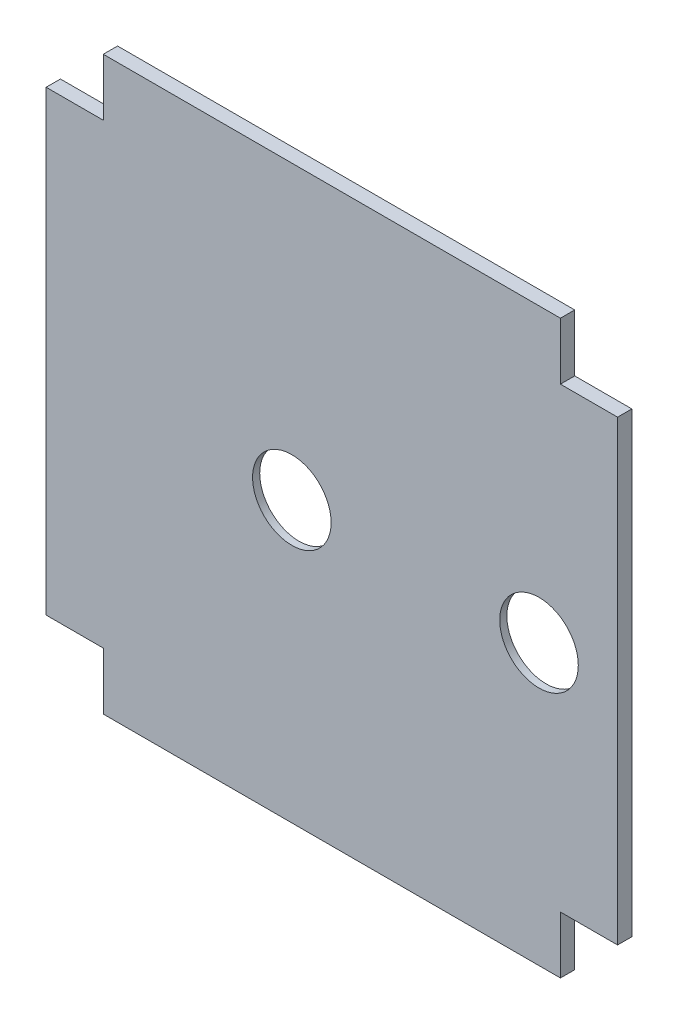
ISO-10303-21;
HEADER;
FILE_DESCRIPTION(('STEP AP214'),'2;1');
FILE_NAME('part.step','',(''),(''),'','','');
FILE_SCHEMA(('AUTOMOTIVE_DESIGN { 1 0 10303 214 1 1 1 1 }'));
ENDSEC;
DATA;
#1=APPLICATION_CONTEXT('core data for automotive mechanical design processes');
#2=APPLICATION_PROTOCOL_DEFINITION('international standard','automotive_design',2000,#1);
#3=PRODUCT_CONTEXT('',#1,'mechanical');
#4=PRODUCT('Part','Part','',(#3));
#5=PRODUCT_RELATED_PRODUCT_CATEGORY('part','',(#4));
#6=PRODUCT_DEFINITION_FORMATION('','',#4);
#7=PRODUCT_DEFINITION_CONTEXT('part definition',#1,'design');
#8=PRODUCT_DEFINITION('design','',#6,#7);
#9=PRODUCT_DEFINITION_SHAPE('','',#8);
#10=(LENGTH_UNIT() NAMED_UNIT(*) SI_UNIT(.MILLI.,.METRE.));
#11=(NAMED_UNIT(*) PLANE_ANGLE_UNIT() SI_UNIT($,.RADIAN.));
#12=(NAMED_UNIT(*) SI_UNIT($,.STERADIAN.) SOLID_ANGLE_UNIT());
#13=UNCERTAINTY_MEASURE_WITH_UNIT(LENGTH_MEASURE(1.E-05),#10,'distance_accuracy_value','');
#14=(GEOMETRIC_REPRESENTATION_CONTEXT(3) GLOBAL_UNCERTAINTY_ASSIGNED_CONTEXT((#13)) GLOBAL_UNIT_ASSIGNED_CONTEXT((#10,
#11,#12)) REPRESENTATION_CONTEXT('',''));
#15=CARTESIAN_POINT('',(0.,0.,0.));
#16=DIRECTION('',(0.,0.,1.));
#17=DIRECTION('',(1.,0.,0.));
#18=AXIS2_PLACEMENT_3D('',#15,#16,#17);
#19=CARTESIAN_POINT('',(43.000042234467,48.9430319989377,0.));
#20=DIRECTION('',(0.,0.,1.));
#21=DIRECTION('',(1.,0.,0.));
#22=AXIS2_PLACEMENT_3D('',#19,#20,#21);
#23=CYLINDRICAL_SURFACE('',#22,6.875);
#24=CARTESIAN_POINT('',(43.000042234467,48.9430319989377,2.5));
#25=DIRECTION('',(0.,0.,1.));
#26=DIRECTION('',(1.,0.,0.));
#27=AXIS2_PLACEMENT_3D('',#24,#25,#26);
#28=CIRCLE('',#27,6.875);
#29=CARTESIAN_POINT('',(49.875042234467,48.9430319989377,2.5));
#30=VERTEX_POINT('',#29);
#31=EDGE_CURVE('E164',#30,#30,#28,.T.);
#32=ORIENTED_EDGE('',*,*,#31,.T.);
#33=EDGE_LOOP('',(#32));
#34=FACE_BOUND('',#33,.T.);
#35=CARTESIAN_POINT('',(43.000042234467,48.9430319989377,1.25));
#36=DIRECTION('',(0.,0.,-1.));
#37=DIRECTION('',(-1.,0.,0.));
#38=AXIS2_PLACEMENT_3D('',#35,#36,#37);
#39=CIRCLE('',#38,6.875);
#40=CARTESIAN_POINT('',(36.125042234467,48.9430319989377,1.25));
#41=VERTEX_POINT('',#40);
#42=EDGE_CURVE('E39',#41,#41,#39,.F.);
#43=ORIENTED_EDGE('',*,*,#42,.F.);
#44=EDGE_LOOP('',(#43));
#45=FACE_BOUND('',#44,.T.);
#46=ADVANCED_FACE('F35',(#34,#45),#23,.F.);
#47=CARTESIAN_POINT('',(86.250042234467,48.9430319989376,0.));
#48=DIRECTION('',(0.,0.,1.));
#49=DIRECTION('',(1.,0.,0.));
#50=AXIS2_PLACEMENT_3D('',#47,#48,#49);
#51=CYLINDRICAL_SURFACE('',#50,6.87499999999999);
#52=CARTESIAN_POINT('',(86.250042234467,48.9430319989376,2.5));
#53=DIRECTION('',(0.,0.,1.));
#54=DIRECTION('',(1.,0.,0.));
#55=AXIS2_PLACEMENT_3D('',#52,#53,#54);
#56=CIRCLE('',#55,6.87499999999999);
#57=CARTESIAN_POINT('',(93.125042234467,48.9430319989376,2.5));
#58=VERTEX_POINT('',#57);
#59=EDGE_CURVE('E171',#58,#58,#56,.T.);
#60=ORIENTED_EDGE('',*,*,#59,.T.);
#61=EDGE_LOOP('',(#60));
#62=FACE_BOUND('',#61,.T.);
#63=CARTESIAN_POINT('',(86.250042234467,48.9430319989376,1.25));
#64=DIRECTION('',(0.,0.,-1.));
#65=DIRECTION('',(-1.,0.,0.));
#66=AXIS2_PLACEMENT_3D('',#63,#64,#65);
#67=CIRCLE('',#66,6.87499999999999);
#68=CARTESIAN_POINT('',(79.375042234467,48.9430319989376,1.25));
#69=VERTEX_POINT('',#68);
#70=EDGE_CURVE('E175',#69,#69,#67,.F.);
#71=ORIENTED_EDGE('',*,*,#70,.F.);
#72=EDGE_LOOP('',(#71));
#73=FACE_BOUND('',#72,.T.);
#74=ADVANCED_FACE('F221',(#62,#73),#51,.F.);
#75=CARTESIAN_POINT('',(0.,0.,2.5));
#76=DIRECTION('',(-1.,0.,0.));
#77=DIRECTION('',(0.,0.,1.));
#78=AXIS2_PLACEMENT_3D('',#75,#76,#77);
#79=PLANE('',#78);
#80=DIRECTION('',(0.,0.,-1.));
#81=VECTOR('',#80,1.);
#82=CARTESIAN_POINT('',(0.,89.9999999999999,2.5));
#83=LINE('',#82,#81);
#84=CARTESIAN_POINT('',(0.,89.9999999999999,2.5));
#85=VERTEX_POINT('',#84);
#86=CARTESIAN_POINT('',(0.,89.9999999999999,0.));
#87=VERTEX_POINT('',#86);
#88=EDGE_CURVE('E286',#85,#87,#83,.T.);
#89=ORIENTED_EDGE('',*,*,#88,.T.);
#90=DIRECTION('',(0.,1.,0.));
#91=VECTOR('',#90,1.);
#92=CARTESIAN_POINT('',(0.,0.,0.));
#93=LINE('',#92,#91);
#94=CARTESIAN_POINT('',(0.,10.0000000000001,0.));
#95=VERTEX_POINT('',#94);
#96=EDGE_CURVE('E147',#95,#87,#93,.T.);
#97=ORIENTED_EDGE('',*,*,#96,.F.);
#98=DIRECTION('',(0.,0.,-1.));
#99=VECTOR('',#98,1.);
#100=CARTESIAN_POINT('',(0.,10.0000000000001,2.5));
#101=LINE('',#100,#99);
#102=CARTESIAN_POINT('',(0.,10.0000000000001,2.5));
#103=VERTEX_POINT('',#102);
#104=EDGE_CURVE('E131',#103,#95,#101,.T.);
#105=ORIENTED_EDGE('',*,*,#104,.F.);
#106=DIRECTION('',(0.,1.,0.));
#107=VECTOR('',#106,1.);
#108=CARTESIAN_POINT('',(0.,0.,2.5));
#109=LINE('',#108,#107);
#110=EDGE_CURVE('E145',#103,#85,#109,.T.);
#111=ORIENTED_EDGE('',*,*,#110,.T.);
#112=EDGE_LOOP('',(#89,#97,#105,#111));
#113=FACE_BOUND('',#112,.T.);
#114=ADVANCED_FACE('F37',(#113),#79,.T.);
#115=CARTESIAN_POINT('',(0.,0.,2.5));
#116=DIRECTION('',(0.,1.,0.));
#117=DIRECTION('',(0.,0.,1.));
#118=AXIS2_PLACEMENT_3D('',#115,#116,#117);
#119=PLANE('',#118);
#120=DIRECTION('',(1.,0.,0.));
#121=VECTOR('',#120,1.);
#122=CARTESIAN_POINT('',(0.,0.,0.));
#123=LINE('',#122,#121);
#124=CARTESIAN_POINT('',(10.0000000000001,0.,0.));
#125=VERTEX_POINT('',#124);
#126=CARTESIAN_POINT('',(89.9999999999999,0.,0.));
#127=VERTEX_POINT('',#126);
#128=EDGE_CURVE('E156',#125,#127,#123,.T.);
#129=ORIENTED_EDGE('',*,*,#128,.T.);
#130=DIRECTION('',(0.,0.,-1.));
#131=VECTOR('',#130,1.);
#132=CARTESIAN_POINT('',(89.9999999999999,0.,2.5));
#133=LINE('',#132,#131);
#134=CARTESIAN_POINT('',(89.9999999999999,0.,2.5));
#135=VERTEX_POINT('',#134);
#136=EDGE_CURVE('E52',#135,#127,#133,.T.);
#137=ORIENTED_EDGE('',*,*,#136,.F.);
#138=DIRECTION('',(1.,0.,0.));
#139=VECTOR('',#138,1.);
#140=CARTESIAN_POINT('',(0.,0.,2.5));
#141=LINE('',#140,#139);
#142=CARTESIAN_POINT('',(10.0000000000001,0.,2.5));
#143=VERTEX_POINT('',#142);
#144=EDGE_CURVE('E11',#143,#135,#141,.T.);
#145=ORIENTED_EDGE('',*,*,#144,.F.);
#146=DIRECTION('',(0.,0.,-1.));
#147=VECTOR('',#146,1.);
#148=CARTESIAN_POINT('',(10.0000000000001,0.,2.5));
#149=LINE('',#148,#147);
#150=EDGE_CURVE('E272',#143,#125,#149,.T.);
#151=ORIENTED_EDGE('',*,*,#150,.T.);
#152=EDGE_LOOP('',(#129,#137,#145,#151));
#153=FACE_BOUND('',#152,.T.);
#154=ADVANCED_FACE('F278',(#153),#119,.F.);
#155=CARTESIAN_POINT('',(100.,0.,2.5));
#156=DIRECTION('',(-1.,0.,0.));
#157=DIRECTION('',(0.,0.,1.));
#158=AXIS2_PLACEMENT_3D('',#155,#156,#157);
#159=PLANE('',#158);
#160=DIRECTION('',(0.,1.,0.));
#161=VECTOR('',#160,1.);
#162=CARTESIAN_POINT('',(100.,0.,2.5));
#163=LINE('',#162,#161);
#164=CARTESIAN_POINT('',(99.9999999999999,10.,2.5));
#165=VERTEX_POINT('',#164);
#166=CARTESIAN_POINT('',(100.,89.9999999999999,2.5));
#167=VERTEX_POINT('',#166);
#168=EDGE_CURVE('E44',#165,#167,#163,.T.);
#169=ORIENTED_EDGE('',*,*,#168,.F.);
#170=DIRECTION('',(0.,0.,-1.));
#171=VECTOR('',#170,1.);
#172=CARTESIAN_POINT('',(99.9999999999999,10.,2.5));
#173=LINE('',#172,#171);
#174=CARTESIAN_POINT('',(99.9999999999999,10.,0.));
#175=VERTEX_POINT('',#174);
#176=EDGE_CURVE('E296',#165,#175,#173,.T.);
#177=ORIENTED_EDGE('',*,*,#176,.T.);
#178=DIRECTION('',(0.,1.,0.));
#179=VECTOR('',#178,1.);
#180=CARTESIAN_POINT('',(100.,0.,0.));
#181=LINE('',#180,#179);
#182=CARTESIAN_POINT('',(100.,89.9999999999999,0.));
#183=VERTEX_POINT('',#182);
#184=EDGE_CURVE('E161',#175,#183,#181,.T.);
#185=ORIENTED_EDGE('',*,*,#184,.T.);
#186=DIRECTION('',(0.,0.,-1.));
#187=VECTOR('',#186,1.);
#188=CARTESIAN_POINT('',(100.,89.9999999999999,2.5));
#189=LINE('',#188,#187);
#190=EDGE_CURVE('E60',#167,#183,#189,.T.);
#191=ORIENTED_EDGE('',*,*,#190,.F.);
#192=EDGE_LOOP('',(#169,#177,#185,#191));
#193=FACE_BOUND('',#192,.T.);
#194=ADVANCED_FACE('F217',(#193),#159,.F.);
#195=CARTESIAN_POINT('',(0.,100.,2.5));
#196=DIRECTION('',(0.,1.,0.));
#197=DIRECTION('',(0.,0.,1.));
#198=AXIS2_PLACEMENT_3D('',#195,#196,#197);
#199=PLANE('',#198);
#200=DIRECTION('',(0.,0.,-1.));
#201=VECTOR('',#200,1.);
#202=CARTESIAN_POINT('',(10.,99.9999999999999,2.5));
#203=LINE('',#202,#201);
#204=CARTESIAN_POINT('',(10.,99.9999999999999,2.5));
#205=VERTEX_POINT('',#204);
#206=CARTESIAN_POINT('',(10.,100.,0.));
#207=VERTEX_POINT('',#206);
#208=EDGE_CURVE('E307',#205,#207,#203,.T.);
#209=ORIENTED_EDGE('',*,*,#208,.F.);
#210=DIRECTION('',(1.,0.,0.));
#211=VECTOR('',#210,1.);
#212=CARTESIAN_POINT('',(0.,100.,2.5));
#213=LINE('',#212,#211);
#214=CARTESIAN_POINT('',(90.,100.,2.5));
#215=VERTEX_POINT('',#214);
#216=EDGE_CURVE('E155',#205,#215,#213,.T.);
#217=ORIENTED_EDGE('',*,*,#216,.T.);
#218=DIRECTION('',(0.,0.,-1.));
#219=VECTOR('',#218,1.);
#220=CARTESIAN_POINT('',(90.,100.,2.5));
#221=LINE('',#220,#219);
#222=CARTESIAN_POINT('',(90.,100.,0.));
#223=VERTEX_POINT('',#222);
#224=EDGE_CURVE('E196',#215,#223,#221,.T.);
#225=ORIENTED_EDGE('',*,*,#224,.T.);
#226=DIRECTION('',(1.,0.,0.));
#227=VECTOR('',#226,1.);
#228=CARTESIAN_POINT('',(0.,100.,0.));
#229=LINE('',#228,#227);
#230=EDGE_CURVE('E170',#207,#223,#229,.T.);
#231=ORIENTED_EDGE('',*,*,#230,.F.);
#232=EDGE_LOOP('',(#209,#217,#225,#231));
#233=FACE_BOUND('',#232,.T.);
#234=ADVANCED_FACE('F207',(#233),#199,.T.);
#235=CARTESIAN_POINT('',(0.,0.,2.5));
#236=DIRECTION('',(0.,0.,-1.));
#237=DIRECTION('',(-1.,0.,0.));
#238=AXIS2_PLACEMENT_3D('',#235,#236,#237);
#239=PLANE('',#238);
#240=ORIENTED_EDGE('',*,*,#59,.F.);
#241=EDGE_LOOP('',(#240));
#242=FACE_BOUND('',#241,.T.);
#243=ORIENTED_EDGE('',*,*,#31,.F.);
#244=EDGE_LOOP('',(#243));
#245=FACE_BOUND('',#244,.T.);
#246=DIRECTION('',(0.,1.,0.));
#247=VECTOR('',#246,1.);
#248=CARTESIAN_POINT('',(89.9999999999999,0.,2.5));
#249=LINE('',#248,#247);
#250=CARTESIAN_POINT('',(89.9999999999999,10.,2.5));
#251=VERTEX_POINT('',#250);
#252=EDGE_CURVE('E288',#135,#251,#249,.T.);
#253=ORIENTED_EDGE('',*,*,#252,.T.);
#254=DIRECTION('',(1.,0.,0.));
#255=VECTOR('',#254,1.);
#256=CARTESIAN_POINT('',(99.9999999999999,10.,2.5));
#257=LINE('',#256,#255);
#258=EDGE_CURVE('E293',#251,#165,#257,.T.);
#259=ORIENTED_EDGE('',*,*,#258,.T.);
#260=ORIENTED_EDGE('',*,*,#168,.T.);
#261=DIRECTION('',(-1.,0.,0.));
#262=VECTOR('',#261,1.);
#263=CARTESIAN_POINT('',(100.,89.9999999999999,2.5));
#264=LINE('',#263,#262);
#265=CARTESIAN_POINT('',(90.,89.9999999999999,2.5));
#266=VERTEX_POINT('',#265);
#267=EDGE_CURVE('E313',#167,#266,#264,.T.);
#268=ORIENTED_EDGE('',*,*,#267,.T.);
#269=DIRECTION('',(0.,1.,0.));
#270=VECTOR('',#269,1.);
#271=CARTESIAN_POINT('',(90.,100.,2.5));
#272=LINE('',#271,#270);
#273=EDGE_CURVE('E316',#266,#215,#272,.T.);
#274=ORIENTED_EDGE('',*,*,#273,.T.);
#275=ORIENTED_EDGE('',*,*,#216,.F.);
#276=DIRECTION('',(0.,-1.,0.));
#277=VECTOR('',#276,1.);
#278=CARTESIAN_POINT('',(10.,99.9999999999999,2.5));
#279=LINE('',#278,#277);
#280=CARTESIAN_POINT('',(10.,89.9999999999999,2.5));
#281=VERTEX_POINT('',#280);
#282=EDGE_CURVE('E303',#205,#281,#279,.T.);
#283=ORIENTED_EDGE('',*,*,#282,.T.);
#284=DIRECTION('',(-1.,0.,0.));
#285=VECTOR('',#284,1.);
#286=CARTESIAN_POINT('',(0.,89.9999999999999,2.5));
#287=LINE('',#286,#285);
#288=EDGE_CURVE('E154',#281,#85,#287,.T.);
#289=ORIENTED_EDGE('',*,*,#288,.T.);
#290=ORIENTED_EDGE('',*,*,#110,.F.);
#291=DIRECTION('',(1.,0.,0.));
#292=VECTOR('',#291,1.);
#293=CARTESIAN_POINT('',(0.,10.0000000000001,2.5));
#294=LINE('',#293,#292);
#295=CARTESIAN_POINT('',(10.0000000000001,10.0000000000001,2.5));
#296=VERTEX_POINT('',#295);
#297=EDGE_CURVE('E127',#103,#296,#294,.T.);
#298=ORIENTED_EDGE('',*,*,#297,.T.);
#299=DIRECTION('',(0.,-1.,0.));
#300=VECTOR('',#299,1.);
#301=CARTESIAN_POINT('',(10.0000000000001,0.,2.5));
#302=LINE('',#301,#300);
#303=EDGE_CURVE('E138',#296,#143,#302,.T.);
#304=ORIENTED_EDGE('',*,*,#303,.T.);
#305=ORIENTED_EDGE('',*,*,#144,.T.);
#306=EDGE_LOOP('',(#253,#259,#260,#268,#274,#275,#283,#289,#290,#298,#304,#305));
#307=FACE_BOUND('',#306,.T.);
#308=ADVANCED_FACE('F151',(#242,#245,#307),#239,.F.);
#309=CARTESIAN_POINT('',(0.,0.,0.));
#310=DIRECTION('',(0.,0.,-1.));
#311=DIRECTION('',(-1.,0.,0.));
#312=AXIS2_PLACEMENT_3D('',#309,#310,#311);
#313=PLANE('',#312);
#314=DIRECTION('',(1.,0.,0.));
#315=VECTOR('',#314,1.);
#316=CARTESIAN_POINT('',(99.9999999999999,10.,0.));
#317=LINE('',#316,#315);
#318=CARTESIAN_POINT('',(89.9999999999999,10.,0.));
#319=VERTEX_POINT('',#318);
#320=EDGE_CURVE('E285',#319,#175,#317,.T.);
#321=ORIENTED_EDGE('',*,*,#320,.F.);
#322=DIRECTION('',(0.,1.,0.));
#323=VECTOR('',#322,1.);
#324=CARTESIAN_POINT('',(89.9999999999999,0.,0.));
#325=LINE('',#324,#323);
#326=EDGE_CURVE('E283',#127,#319,#325,.T.);
#327=ORIENTED_EDGE('',*,*,#326,.F.);
#328=ORIENTED_EDGE('',*,*,#128,.F.);
#329=DIRECTION('',(0.,-1.,0.));
#330=VECTOR('',#329,1.);
#331=CARTESIAN_POINT('',(10.0000000000001,0.,0.));
#332=LINE('',#331,#330);
#333=CARTESIAN_POINT('',(10.0000000000001,10.0000000000001,0.));
#334=VERTEX_POINT('',#333);
#335=EDGE_CURVE('E139',#334,#125,#332,.T.);
#336=ORIENTED_EDGE('',*,*,#335,.F.);
#337=DIRECTION('',(1.,0.,0.));
#338=VECTOR('',#337,1.);
#339=CARTESIAN_POINT('',(0.,10.0000000000001,0.));
#340=LINE('',#339,#338);
#341=EDGE_CURVE('E274',#95,#334,#340,.T.);
#342=ORIENTED_EDGE('',*,*,#341,.F.);
#343=ORIENTED_EDGE('',*,*,#96,.T.);
#344=DIRECTION('',(-1.,0.,0.));
#345=VECTOR('',#344,1.);
#346=CARTESIAN_POINT('',(0.,89.9999999999999,0.));
#347=LINE('',#346,#345);
#348=CARTESIAN_POINT('',(10.,89.9999999999999,0.));
#349=VERTEX_POINT('',#348);
#350=EDGE_CURVE('E305',#349,#87,#347,.T.);
#351=ORIENTED_EDGE('',*,*,#350,.F.);
#352=DIRECTION('',(0.,-1.,0.));
#353=VECTOR('',#352,1.);
#354=CARTESIAN_POINT('',(10.,99.9999999999999,0.));
#355=LINE('',#354,#353);
#356=EDGE_CURVE('E279',#207,#349,#355,.T.);
#357=ORIENTED_EDGE('',*,*,#356,.F.);
#358=ORIENTED_EDGE('',*,*,#230,.T.);
#359=DIRECTION('',(0.,1.,0.));
#360=VECTOR('',#359,1.);
#361=CARTESIAN_POINT('',(90.,100.,0.));
#362=LINE('',#361,#360);
#363=CARTESIAN_POINT('',(90.,89.9999999999999,0.));
#364=VERTEX_POINT('',#363);
#365=EDGE_CURVE('E317',#364,#223,#362,.T.);
#366=ORIENTED_EDGE('',*,*,#365,.F.);
#367=DIRECTION('',(-1.,0.,0.));
#368=VECTOR('',#367,1.);
#369=CARTESIAN_POINT('',(100.,89.9999999999999,0.));
#370=LINE('',#369,#368);
#371=EDGE_CURVE('E299',#183,#364,#370,.T.);
#372=ORIENTED_EDGE('',*,*,#371,.F.);
#373=ORIENTED_EDGE('',*,*,#184,.F.);
#374=EDGE_LOOP('',(#321,#327,#328,#336,#342,#343,#351,#357,#358,#366,#372,#373));
#375=FACE_BOUND('',#374,.T.);
#376=CARTESIAN_POINT('',(86.250042234467,48.9430319989376,0.));
#377=DIRECTION('',(0.,0.,-1.));
#378=DIRECTION('',(-1.,0.,0.));
#379=AXIS2_PLACEMENT_3D('',#376,#377,#378);
#380=CIRCLE('',#379,8.75000000000001);
#381=CARTESIAN_POINT('',(77.500042234467,48.9430319989376,0.));
#382=VERTEX_POINT('',#381);
#383=EDGE_CURVE('E182',#382,#382,#380,.T.);
#384=ORIENTED_EDGE('',*,*,#383,.F.);
#385=EDGE_LOOP('',(#384));
#386=FACE_BOUND('',#385,.T.);
#387=CARTESIAN_POINT('',(43.000042234467,48.9430319989377,0.));
#388=DIRECTION('',(0.,0.,-1.));
#389=DIRECTION('',(-1.,0.,0.));
#390=AXIS2_PLACEMENT_3D('',#387,#388,#389);
#391=CIRCLE('',#390,8.75);
#392=CARTESIAN_POINT('',(34.250042234467,48.9430319989377,0.));
#393=VERTEX_POINT('',#392);
#394=EDGE_CURVE('E194',#393,#393,#391,.T.);
#395=ORIENTED_EDGE('',*,*,#394,.F.);
#396=EDGE_LOOP('',(#395));
#397=FACE_BOUND('',#396,.T.);
#398=ADVANCED_FACE('F206',(#375,#386,#397),#313,.T.);
#399=CARTESIAN_POINT('',(86.250042234467,48.9430319989376,1.25));
#400=DIRECTION('',(0.,0.,-1.));
#401=DIRECTION('',(-1.,0.,0.));
#402=AXIS2_PLACEMENT_3D('',#399,#400,#401);
#403=PLANE('',#402);
#404=CARTESIAN_POINT('',(86.250042234467,48.9430319989376,1.25));
#405=DIRECTION('',(0.,0.,-1.));
#406=DIRECTION('',(-1.,0.,0.));
#407=AXIS2_PLACEMENT_3D('',#404,#405,#406);
#408=CIRCLE('',#407,8.75000000000001);
#409=CARTESIAN_POINT('',(77.500042234467,48.9430319989376,1.25));
#410=VERTEX_POINT('',#409);
#411=EDGE_CURVE('E177',#410,#410,#408,.T.);
#412=ORIENTED_EDGE('',*,*,#411,.T.);
#413=EDGE_LOOP('',(#412));
#414=FACE_BOUND('',#413,.T.);
#415=ORIENTED_EDGE('',*,*,#70,.T.);
#416=EDGE_LOOP('',(#415));
#417=FACE_BOUND('',#416,.T.);
#418=ADVANCED_FACE('F214',(#414,#417),#403,.T.);
#419=CARTESIAN_POINT('',(86.250042234467,48.9430319989376,1.25));
#420=DIRECTION('',(0.,0.,-1.));
#421=DIRECTION('',(-1.,0.,0.));
#422=AXIS2_PLACEMENT_3D('',#419,#420,#421);
#423=CYLINDRICAL_SURFACE('',#422,8.75000000000001);
#424=ORIENTED_EDGE('',*,*,#411,.F.);
#425=EDGE_LOOP('',(#424));
#426=FACE_BOUND('',#425,.T.);
#427=ORIENTED_EDGE('',*,*,#383,.T.);
#428=EDGE_LOOP('',(#427));
#429=FACE_BOUND('',#428,.T.);
#430=ADVANCED_FACE('F235',(#426,#429),#423,.F.);
#431=CARTESIAN_POINT('',(43.000042234467,48.9430319989377,1.25));
#432=DIRECTION('',(0.,0.,-1.));
#433=DIRECTION('',(-1.,0.,0.));
#434=AXIS2_PLACEMENT_3D('',#431,#432,#433);
#435=PLANE('',#434);
#436=CARTESIAN_POINT('',(43.000042234467,48.9430319989377,1.25));
#437=DIRECTION('',(0.,0.,-1.));
#438=DIRECTION('',(-1.,0.,0.));
#439=AXIS2_PLACEMENT_3D('',#436,#437,#438);
#440=CIRCLE('',#439,8.75);
#441=CARTESIAN_POINT('',(34.250042234467,48.9430319989377,1.25));
#442=VERTEX_POINT('',#441);
#443=EDGE_CURVE('E187',#442,#442,#440,.T.);
#444=ORIENTED_EDGE('',*,*,#443,.T.);
#445=EDGE_LOOP('',(#444));
#446=FACE_BOUND('',#445,.T.);
#447=ORIENTED_EDGE('',*,*,#42,.T.);
#448=EDGE_LOOP('',(#447));
#449=FACE_BOUND('',#448,.T.);
#450=ADVANCED_FACE('F231',(#446,#449),#435,.T.);
#451=CARTESIAN_POINT('',(43.000042234467,48.9430319989377,1.25));
#452=DIRECTION('',(0.,0.,-1.));
#453=DIRECTION('',(-1.,0.,0.));
#454=AXIS2_PLACEMENT_3D('',#451,#452,#453);
#455=CYLINDRICAL_SURFACE('',#454,8.75);
#456=ORIENTED_EDGE('',*,*,#443,.F.);
#457=EDGE_LOOP('',(#456));
#458=FACE_BOUND('',#457,.T.);
#459=ORIENTED_EDGE('',*,*,#394,.T.);
#460=EDGE_LOOP('',(#459));
#461=FACE_BOUND('',#460,.T.);
#462=ADVANCED_FACE('F227',(#458,#461),#455,.F.);
#463=CARTESIAN_POINT('',(90.,100.,2.5));
#464=DIRECTION('',(-1.,0.,0.));
#465=DIRECTION('',(0.,0.,1.));
#466=AXIS2_PLACEMENT_3D('',#463,#464,#465);
#467=PLANE('',#466);
#468=ORIENTED_EDGE('',*,*,#365,.T.);
#469=ORIENTED_EDGE('',*,*,#224,.F.);
#470=ORIENTED_EDGE('',*,*,#273,.F.);
#471=DIRECTION('',(0.,0.,-1.));
#472=VECTOR('',#471,1.);
#473=CARTESIAN_POINT('',(90.,89.9999999999999,2.5));
#474=LINE('',#473,#472);
#475=EDGE_CURVE('E323',#266,#364,#474,.T.);
#476=ORIENTED_EDGE('',*,*,#475,.T.);
#477=EDGE_LOOP('',(#468,#469,#470,#476));
#478=FACE_BOUND('',#477,.T.);
#479=ADVANCED_FACE('F230',(#478),#467,.F.);
#480=CARTESIAN_POINT('',(100.,89.9999999999999,2.5));
#481=DIRECTION('',(0.,-1.,0.));
#482=DIRECTION('',(0.,0.,-1.));
#483=AXIS2_PLACEMENT_3D('',#480,#481,#482);
#484=PLANE('',#483);
#485=ORIENTED_EDGE('',*,*,#371,.T.);
#486=ORIENTED_EDGE('',*,*,#475,.F.);
#487=ORIENTED_EDGE('',*,*,#267,.F.);
#488=ORIENTED_EDGE('',*,*,#190,.T.);
#489=EDGE_LOOP('',(#485,#486,#487,#488));
#490=FACE_BOUND('',#489,.T.);
#491=ADVANCED_FACE('F242',(#490),#484,.F.);
#492=CARTESIAN_POINT('',(10.0000000000001,0.,2.5));
#493=DIRECTION('',(1.,0.,0.));
#494=DIRECTION('',(0.,0.,-1.));
#495=AXIS2_PLACEMENT_3D('',#492,#493,#494);
#496=PLANE('',#495);
#497=ORIENTED_EDGE('',*,*,#335,.T.);
#498=ORIENTED_EDGE('',*,*,#150,.F.);
#499=ORIENTED_EDGE('',*,*,#303,.F.);
#500=DIRECTION('',(0.,0.,-1.));
#501=VECTOR('',#500,1.);
#502=CARTESIAN_POINT('',(10.0000000000001,10.0000000000001,2.5));
#503=LINE('',#502,#501);
#504=EDGE_CURVE('E133',#296,#334,#503,.T.);
#505=ORIENTED_EDGE('',*,*,#504,.T.);
#506=EDGE_LOOP('',(#497,#498,#499,#505));
#507=FACE_BOUND('',#506,.T.);
#508=ADVANCED_FACE('F245',(#507),#496,.F.);
#509=CARTESIAN_POINT('',(0.,10.0000000000001,2.5));
#510=DIRECTION('',(0.,1.,0.));
#511=DIRECTION('',(-1.,0.,0.));
#512=AXIS2_PLACEMENT_3D('',#509,#510,#511);
#513=PLANE('',#512);
#514=ORIENTED_EDGE('',*,*,#341,.T.);
#515=ORIENTED_EDGE('',*,*,#504,.F.);
#516=ORIENTED_EDGE('',*,*,#297,.F.);
#517=ORIENTED_EDGE('',*,*,#104,.T.);
#518=EDGE_LOOP('',(#514,#515,#516,#517));
#519=FACE_BOUND('',#518,.T.);
#520=ADVANCED_FACE('F130',(#519),#513,.F.);
#521=CARTESIAN_POINT('',(0.,89.9999999999999,2.5));
#522=DIRECTION('',(0.,-1.,0.));
#523=DIRECTION('',(0.,0.,-1.));
#524=AXIS2_PLACEMENT_3D('',#521,#522,#523);
#525=PLANE('',#524);
#526=ORIENTED_EDGE('',*,*,#350,.T.);
#527=ORIENTED_EDGE('',*,*,#88,.F.);
#528=ORIENTED_EDGE('',*,*,#288,.F.);
#529=DIRECTION('',(0.,0.,-1.));
#530=VECTOR('',#529,1.);
#531=CARTESIAN_POINT('',(10.,89.9999999999999,2.5));
#532=LINE('',#531,#530);
#533=EDGE_CURVE('E290',#281,#349,#532,.T.);
#534=ORIENTED_EDGE('',*,*,#533,.T.);
#535=EDGE_LOOP('',(#526,#527,#528,#534));
#536=FACE_BOUND('',#535,.T.);
#537=ADVANCED_FACE('F253',(#536),#525,.F.);
#538=CARTESIAN_POINT('',(10.,99.9999999999999,2.5));
#539=DIRECTION('',(1.,0.,0.));
#540=DIRECTION('',(0.,1.,0.));
#541=AXIS2_PLACEMENT_3D('',#538,#539,#540);
#542=PLANE('',#541);
#543=ORIENTED_EDGE('',*,*,#356,.T.);
#544=ORIENTED_EDGE('',*,*,#533,.F.);
#545=ORIENTED_EDGE('',*,*,#282,.F.);
#546=ORIENTED_EDGE('',*,*,#208,.T.);
#547=EDGE_LOOP('',(#543,#544,#545,#546));
#548=FACE_BOUND('',#547,.T.);
#549=ADVANCED_FACE('F249',(#548),#542,.F.);
#550=CARTESIAN_POINT('',(99.9999999999999,10.,2.5));
#551=DIRECTION('',(0.,1.,0.));
#552=DIRECTION('',(0.,0.,1.));
#553=AXIS2_PLACEMENT_3D('',#550,#551,#552);
#554=PLANE('',#553);
#555=ORIENTED_EDGE('',*,*,#320,.T.);
#556=ORIENTED_EDGE('',*,*,#176,.F.);
#557=ORIENTED_EDGE('',*,*,#258,.F.);
#558=DIRECTION('',(0.,0.,-1.));
#559=VECTOR('',#558,1.);
#560=CARTESIAN_POINT('',(89.9999999999999,10.,2.5));
#561=LINE('',#560,#559);
#562=EDGE_CURVE('E300',#251,#319,#561,.T.);
#563=ORIENTED_EDGE('',*,*,#562,.T.);
#564=EDGE_LOOP('',(#555,#556,#557,#563));
#565=FACE_BOUND('',#564,.T.);
#566=ADVANCED_FACE('F252',(#565),#554,.F.);
#567=CARTESIAN_POINT('',(89.9999999999999,0.,2.5));
#568=DIRECTION('',(-1.,0.,0.));
#569=DIRECTION('',(0.,0.,1.));
#570=AXIS2_PLACEMENT_3D('',#567,#568,#569);
#571=PLANE('',#570);
#572=ORIENTED_EDGE('',*,*,#326,.T.);
#573=ORIENTED_EDGE('',*,*,#562,.F.);
#574=ORIENTED_EDGE('',*,*,#252,.F.);
#575=ORIENTED_EDGE('',*,*,#136,.T.);
#576=EDGE_LOOP('',(#572,#573,#574,#575));
#577=FACE_BOUND('',#576,.T.);
#578=ADVANCED_FACE('F258',(#577),#571,.F.);
#579=CLOSED_SHELL('',(#46,#74,#114,#154,#194,#234,#308,#398,#418,#430,#450,#462,#479,#491,#508,
#520,#537,#549,#566,#578));
#580=MANIFOLD_SOLID_BREP('B2',#579);
#581=ADVANCED_BREP_SHAPE_REPRESENTATION('',(#18,#580),#14);
#582=SHAPE_DEFINITION_REPRESENTATION(#9,#581);
ENDSEC;
END-ISO-10303-21;
